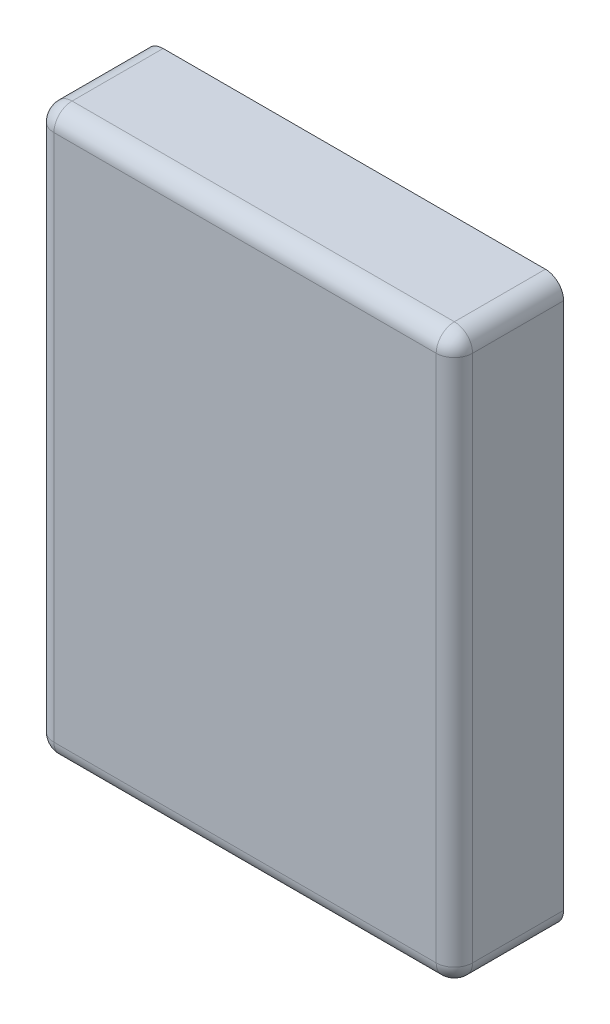
ISO-10303-21;
HEADER;
FILE_DESCRIPTION(('STEP AP214'),'2;1');
FILE_NAME('part.step','',(''),(''),'','','');
FILE_SCHEMA(('AUTOMOTIVE_DESIGN { 1 0 10303 214 1 1 1 1 }'));
ENDSEC;
DATA;
#1=APPLICATION_CONTEXT('core data for automotive mechanical design processes');
#2=APPLICATION_PROTOCOL_DEFINITION('international standard','automotive_design',2000,#1);
#3=PRODUCT_CONTEXT('',#1,'mechanical');
#4=PRODUCT('Part','Part','',(#3));
#5=PRODUCT_RELATED_PRODUCT_CATEGORY('part','',(#4));
#6=PRODUCT_DEFINITION_FORMATION('','',#4);
#7=PRODUCT_DEFINITION_CONTEXT('part definition',#1,'design');
#8=PRODUCT_DEFINITION('design','',#6,#7);
#9=PRODUCT_DEFINITION_SHAPE('','',#8);
#10=(LENGTH_UNIT() NAMED_UNIT(*) SI_UNIT(.MILLI.,.METRE.));
#11=(NAMED_UNIT(*) PLANE_ANGLE_UNIT() SI_UNIT($,.RADIAN.));
#12=(NAMED_UNIT(*) SI_UNIT($,.STERADIAN.) SOLID_ANGLE_UNIT());
#13=UNCERTAINTY_MEASURE_WITH_UNIT(LENGTH_MEASURE(1.E-05),#10,'distance_accuracy_value','');
#14=(GEOMETRIC_REPRESENTATION_CONTEXT(3) GLOBAL_UNCERTAINTY_ASSIGNED_CONTEXT((#13)) GLOBAL_UNIT_ASSIGNED_CONTEXT((#10,
#11,#12)) REPRESENTATION_CONTEXT('',''));
#15=CARTESIAN_POINT('',(0.,0.,0.));
#16=DIRECTION('',(0.,0.,1.));
#17=DIRECTION('',(1.,0.,0.));
#18=AXIS2_PLACEMENT_3D('',#15,#16,#17);
#19=CARTESIAN_POINT('',(8.817392921448,4.208681869507,1.13324762907E-08));
#20=DIRECTION('',(0.,1.,0.));
#21=DIRECTION('',(1.,0.,0.));
#22=AXIS2_PLACEMENT_3D('',#19,#20,#21);
#23=PLANE('',#22);
#24=DIRECTION('',(1.,0.,0.));
#25=VECTOR('',#24,1.);
#26=CARTESIAN_POINT('',(8.817392921448,4.208681869507,1.13324762907E-08));
#27=LINE('',#26,#25);
#28=CARTESIAN_POINT('',(8.917392921448,4.208681869507,1.13324762907E-08));
#29=VERTEX_POINT('',#28);
#30=CARTESIAN_POINT('',(11.017392921448,4.208681869507,1.13324762907E-08));
#31=VERTEX_POINT('',#30);
#32=EDGE_CURVE('E40',#29,#31,#27,.T.);
#33=ORIENTED_EDGE('',*,*,#32,.F.);
#34=DIRECTION('',(0.,0.,1.));
#35=VECTOR('',#34,1.);
#36=CARTESIAN_POINT('',(8.917392921448,4.208681869507,1.13324762907E-08));
#37=LINE('',#36,#35);
#38=CARTESIAN_POINT('',(8.917392921448,4.208681869507,0.500000011332));
#39=VERTEX_POINT('',#38);
#40=EDGE_CURVE('E11',#29,#39,#37,.T.);
#41=ORIENTED_EDGE('',*,*,#40,.T.);
#42=DIRECTION('',(1.,0.,0.));
#43=VECTOR('',#42,1.);
#44=CARTESIAN_POINT('',(8.817392921448,4.208681869507,0.500000011332));
#45=LINE('',#44,#43);
#46=CARTESIAN_POINT('',(11.017392921448,4.208681869507,0.500000011332));
#47=VERTEX_POINT('',#46);
#48=EDGE_CURVE('E27',#39,#47,#45,.T.);
#49=ORIENTED_EDGE('',*,*,#48,.T.);
#50=DIRECTION('',(0.,0.,1.));
#51=VECTOR('',#50,1.);
#52=CARTESIAN_POINT('',(11.017392921448,4.208681869507,1.13324762907E-08));
#53=LINE('',#52,#51);
#54=EDGE_CURVE('E208',#31,#47,#53,.T.);
#55=ORIENTED_EDGE('',*,*,#54,.F.);
#56=EDGE_LOOP('',(#33,#41,#49,#55));
#57=FACE_BOUND('',#56,.T.);
#58=ADVANCED_FACE('F16',(#57),#23,.T.);
#59=CARTESIAN_POINT('',(9.967392921448,2.658681869507,1.13324762907E-08));
#60=DIRECTION('',(0.,0.,1.));
#61=DIRECTION('',(1.,0.,0.));
#62=AXIS2_PLACEMENT_3D('',#59,#60,#61);
#63=PLANE('',#62);
#64=CARTESIAN_POINT('',(11.017392921448,4.108681869507,1.13324762907E-08));
#65=DIRECTION('',(0.,0.,-1.));
#66=DIRECTION('',(0.,-1.,0.));
#67=AXIS2_PLACEMENT_3D('',#64,#65,#66);
#68=CIRCLE('',#67,0.1);
#69=CARTESIAN_POINT('',(11.117392921448,4.108681869507,1.13324762907E-08));
#70=VERTEX_POINT('',#69);
#71=EDGE_CURVE('E212',#31,#70,#68,.T.);
#72=ORIENTED_EDGE('',*,*,#71,.T.);
#73=DIRECTION('',(0.,-1.,0.));
#74=VECTOR('',#73,1.);
#75=CARTESIAN_POINT('',(11.117392921448,4.208681869507,1.13324762907E-08));
#76=LINE('',#75,#74);
#77=CARTESIAN_POINT('',(11.117392921448,1.208681869507,1.13324762907E-08));
#78=VERTEX_POINT('',#77);
#79=EDGE_CURVE('E96',#70,#78,#76,.T.);
#80=ORIENTED_EDGE('',*,*,#79,.T.);
#81=CARTESIAN_POINT('',(11.017392921448,1.208681869507,1.13324762907E-08));
#82=DIRECTION('',(0.,0.,-1.));
#83=DIRECTION('',(0.,-1.,0.));
#84=AXIS2_PLACEMENT_3D('',#81,#82,#83);
#85=CIRCLE('',#84,0.1);
#86=CARTESIAN_POINT('',(11.017392921448,1.108681869507,1.13324762907E-08));
#87=VERTEX_POINT('',#86);
#88=EDGE_CURVE('E110',#78,#87,#85,.T.);
#89=ORIENTED_EDGE('',*,*,#88,.T.);
#90=DIRECTION('',(-1.,0.,0.));
#91=VECTOR('',#90,1.);
#92=CARTESIAN_POINT('',(11.117392921448,1.108681869507,1.13324762907E-08));
#93=LINE('',#92,#91);
#94=CARTESIAN_POINT('',(8.917392921448,1.108681869507,1.13324762907E-08));
#95=VERTEX_POINT('',#94);
#96=EDGE_CURVE('E178',#87,#95,#93,.T.);
#97=ORIENTED_EDGE('',*,*,#96,.T.);
#98=CARTESIAN_POINT('',(8.917392921448,1.208681869507,1.13324762907E-08));
#99=DIRECTION('',(0.,0.,-1.));
#100=DIRECTION('',(0.,-1.,0.));
#101=AXIS2_PLACEMENT_3D('',#98,#99,#100);
#102=CIRCLE('',#101,0.1);
#103=CARTESIAN_POINT('',(8.817392921448,1.208681869507,1.13324762907E-08));
#104=VERTEX_POINT('',#103);
#105=EDGE_CURVE('E200',#95,#104,#102,.T.);
#106=ORIENTED_EDGE('',*,*,#105,.T.);
#107=DIRECTION('',(0.,1.,0.));
#108=VECTOR('',#107,1.);
#109=CARTESIAN_POINT('',(8.817392921448,1.108681869507,1.13324762907E-08));
#110=LINE('',#109,#108);
#111=CARTESIAN_POINT('',(8.817392921448,4.108681869507,1.13324762907E-08));
#112=VERTEX_POINT('',#111);
#113=EDGE_CURVE('E65',#104,#112,#110,.T.);
#114=ORIENTED_EDGE('',*,*,#113,.T.);
#115=CARTESIAN_POINT('',(8.917392921448,4.108681869507,1.13324762907E-08));
#116=DIRECTION('',(0.,0.,1.));
#117=DIRECTION('',(0.,-1.,0.));
#118=AXIS2_PLACEMENT_3D('',#115,#116,#117);
#119=CIRCLE('',#118,0.1);
#120=EDGE_CURVE('E79',#29,#112,#119,.T.);
#121=ORIENTED_EDGE('',*,*,#120,.F.);
#122=ORIENTED_EDGE('',*,*,#32,.T.);
#123=EDGE_LOOP('',(#72,#80,#89,#97,#106,#114,#121,#122));
#124=FACE_BOUND('',#123,.T.);
#125=ADVANCED_FACE('F302',(#124),#63,.F.);
#126=CARTESIAN_POINT('',(8.917392921448,4.108681869507,1.13324762907E-08));
#127=DIRECTION('',(0.,0.,1.));
#128=DIRECTION('',(0.,1.,0.));
#129=AXIS2_PLACEMENT_3D('',#126,#127,#128);
#130=CYLINDRICAL_SURFACE('',#129,0.1);
#131=ORIENTED_EDGE('',*,*,#120,.T.);
#132=DIRECTION('',(0.,0.,1.));
#133=VECTOR('',#132,1.);
#134=CARTESIAN_POINT('',(8.817392921448,4.108681869507,1.13324762907E-08));
#135=LINE('',#134,#133);
#136=CARTESIAN_POINT('',(8.817392921448,4.108681869507,0.500000011332));
#137=VERTEX_POINT('',#136);
#138=EDGE_CURVE('E205',#112,#137,#135,.T.);
#139=ORIENTED_EDGE('',*,*,#138,.T.);
#140=CARTESIAN_POINT('',(8.917392921448,4.108681869507,0.500000011332));
#141=DIRECTION('',(0.,0.,1.));
#142=DIRECTION('',(0.,1.,0.));
#143=AXIS2_PLACEMENT_3D('',#140,#141,#142);
#144=CIRCLE('',#143,0.1);
#145=EDGE_CURVE('E174',#39,#137,#144,.T.);
#146=ORIENTED_EDGE('',*,*,#145,.F.);
#147=ORIENTED_EDGE('',*,*,#40,.F.);
#148=EDGE_LOOP('',(#131,#139,#146,#147));
#149=FACE_BOUND('',#148,.T.);
#150=ADVANCED_FACE('F301',(#149),#130,.T.);
#151=CARTESIAN_POINT('',(11.017392921448,4.108681869507,1.13324762907E-08));
#152=DIRECTION('',(0.,0.,1.));
#153=DIRECTION('',(0.,1.,0.));
#154=AXIS2_PLACEMENT_3D('',#151,#152,#153);
#155=CYLINDRICAL_SURFACE('',#154,0.1);
#156=ORIENTED_EDGE('',*,*,#54,.T.);
#157=CARTESIAN_POINT('',(11.017392921448,4.108681869507,0.500000011332));
#158=DIRECTION('',(0.,0.,1.));
#159=DIRECTION('',(0.,1.,0.));
#160=AXIS2_PLACEMENT_3D('',#157,#158,#159);
#161=CIRCLE('',#160,0.1);
#162=CARTESIAN_POINT('',(11.117392921448,4.108681869507,0.500000011332));
#163=VERTEX_POINT('',#162);
#164=EDGE_CURVE('E122',#163,#47,#161,.T.);
#165=ORIENTED_EDGE('',*,*,#164,.F.);
#166=DIRECTION('',(0.,0.,1.));
#167=VECTOR('',#166,1.);
#168=CARTESIAN_POINT('',(11.117392921448,4.108681869507,1.13324762907E-08));
#169=LINE('',#168,#167);
#170=EDGE_CURVE('E258',#70,#163,#169,.T.);
#171=ORIENTED_EDGE('',*,*,#170,.F.);
#172=ORIENTED_EDGE('',*,*,#71,.F.);
#173=EDGE_LOOP('',(#156,#165,#171,#172));
#174=FACE_BOUND('',#173,.T.);
#175=ADVANCED_FACE('F329',(#174),#155,.T.);
#176=CARTESIAN_POINT('',(8.817392921448,4.108681869507,0.500000011332));
#177=DIRECTION('',(1.,0.,0.));
#178=DIRECTION('',(0.,1.,0.));
#179=AXIS2_PLACEMENT_3D('',#176,#177,#178);
#180=CYLINDRICAL_SURFACE('',#179,0.1);
#181=CARTESIAN_POINT('',(8.917392921448,4.108681869507,0.500000011332));
#182=DIRECTION('',(-1.,0.,0.));
#183=DIRECTION('',(0.,1.,0.));
#184=AXIS2_PLACEMENT_3D('',#181,#182,#183);
#185=CIRCLE('',#184,0.1);
#186=CARTESIAN_POINT('',(8.917392921448,4.108681869507,0.600000011332));
#187=VERTEX_POINT('',#186);
#188=EDGE_CURVE('E222',#187,#39,#185,.T.);
#189=ORIENTED_EDGE('',*,*,#188,.F.);
#190=DIRECTION('',(1.,0.,0.));
#191=VECTOR('',#190,1.);
#192=CARTESIAN_POINT('',(8.817392921448,4.108681869507,0.600000011332));
#193=LINE('',#192,#191);
#194=CARTESIAN_POINT('',(11.017392921448,4.108681869507,0.600000011332));
#195=VERTEX_POINT('',#194);
#196=EDGE_CURVE('E268',#187,#195,#193,.T.);
#197=ORIENTED_EDGE('',*,*,#196,.T.);
#198=CARTESIAN_POINT('',(11.017392921448,4.108681869507,0.500000011332));
#199=DIRECTION('',(1.,0.,0.));
#200=DIRECTION('',(0.,1.,0.));
#201=AXIS2_PLACEMENT_3D('',#198,#199,#200);
#202=CIRCLE('',#201,0.1);
#203=EDGE_CURVE('E221',#47,#195,#202,.T.);
#204=ORIENTED_EDGE('',*,*,#203,.F.);
#205=ORIENTED_EDGE('',*,*,#48,.F.);
#206=EDGE_LOOP('',(#189,#197,#204,#205));
#207=FACE_BOUND('',#206,.T.);
#208=ADVANCED_FACE('F298',(#207),#180,.T.);
#209=CARTESIAN_POINT('',(8.817392921448,1.108681869507,1.13324762907E-08));
#210=DIRECTION('',(-1.,0.,0.));
#211=DIRECTION('',(0.,0.,1.));
#212=AXIS2_PLACEMENT_3D('',#209,#210,#211);
#213=PLANE('',#212);
#214=ORIENTED_EDGE('',*,*,#113,.F.);
#215=DIRECTION('',(0.,0.,1.));
#216=VECTOR('',#215,1.);
#217=CARTESIAN_POINT('',(8.817392921448,1.208681869507,1.13324762907E-08));
#218=LINE('',#217,#216);
#219=CARTESIAN_POINT('',(8.817392921448,1.208681869507,0.500000011332));
#220=VERTEX_POINT('',#219);
#221=EDGE_CURVE('E193',#104,#220,#218,.T.);
#222=ORIENTED_EDGE('',*,*,#221,.T.);
#223=DIRECTION('',(0.,1.,0.));
#224=VECTOR('',#223,1.);
#225=CARTESIAN_POINT('',(8.817392921448,1.108681869507,0.500000011332));
#226=LINE('',#225,#224);
#227=EDGE_CURVE('E267',#220,#137,#226,.T.);
#228=ORIENTED_EDGE('',*,*,#227,.T.);
#229=ORIENTED_EDGE('',*,*,#138,.F.);
#230=EDGE_LOOP('',(#214,#222,#228,#229));
#231=FACE_BOUND('',#230,.T.);
#232=ADVANCED_FACE('F284',(#231),#213,.T.);
#233=CARTESIAN_POINT('',(11.117392921448,4.208681869507,1.13324762907E-08));
#234=DIRECTION('',(1.,0.,0.));
#235=DIRECTION('',(0.,1.,0.));
#236=AXIS2_PLACEMENT_3D('',#233,#234,#235);
#237=PLANE('',#236);
#238=ORIENTED_EDGE('',*,*,#79,.F.);
#239=ORIENTED_EDGE('',*,*,#170,.T.);
#240=DIRECTION('',(0.,-1.,0.));
#241=VECTOR('',#240,1.);
#242=CARTESIAN_POINT('',(11.117392921448,4.208681869507,0.500000011332));
#243=LINE('',#242,#241);
#244=CARTESIAN_POINT('',(11.117392921448,1.208681869507,0.500000011332));
#245=VERTEX_POINT('',#244);
#246=EDGE_CURVE('E217',#163,#245,#243,.T.);
#247=ORIENTED_EDGE('',*,*,#246,.T.);
#248=DIRECTION('',(0.,0.,1.));
#249=VECTOR('',#248,1.);
#250=CARTESIAN_POINT('',(11.117392921448,1.208681869507,1.13324762907E-08));
#251=LINE('',#250,#249);
#252=EDGE_CURVE('E159',#78,#245,#251,.T.);
#253=ORIENTED_EDGE('',*,*,#252,.F.);
#254=EDGE_LOOP('',(#238,#239,#247,#253));
#255=FACE_BOUND('',#254,.T.);
#256=ADVANCED_FACE('F309',(#255),#237,.T.);
#257=CARTESIAN_POINT('',(8.917392921448,1.208681869507,1.13324762907E-08));
#258=DIRECTION('',(0.,0.,1.));
#259=DIRECTION('',(0.,-1.,0.));
#260=AXIS2_PLACEMENT_3D('',#257,#258,#259);
#261=CYLINDRICAL_SURFACE('',#260,0.1);
#262=DIRECTION('',(0.,0.,1.));
#263=VECTOR('',#262,1.);
#264=CARTESIAN_POINT('',(8.917392921448,1.108681869507,1.13324762907E-08));
#265=LINE('',#264,#263);
#266=CARTESIAN_POINT('',(8.917392921448,1.108681869507,0.500000011332));
#267=VERTEX_POINT('',#266);
#268=EDGE_CURVE('E213',#95,#267,#265,.T.);
#269=ORIENTED_EDGE('',*,*,#268,.T.);
#270=CARTESIAN_POINT('',(8.917392921448,1.208681869507,0.500000011332));
#271=DIRECTION('',(0.,0.,-1.));
#272=DIRECTION('',(-1.,0.,0.));
#273=AXIS2_PLACEMENT_3D('',#270,#271,#272);
#274=CIRCLE('',#273,0.1);
#275=EDGE_CURVE('E218',#267,#220,#274,.T.);
#276=ORIENTED_EDGE('',*,*,#275,.T.);
#277=ORIENTED_EDGE('',*,*,#221,.F.);
#278=ORIENTED_EDGE('',*,*,#105,.F.);
#279=EDGE_LOOP('',(#269,#276,#277,#278));
#280=FACE_BOUND('',#279,.T.);
#281=ADVANCED_FACE('F304',(#280),#261,.T.);
#282=CARTESIAN_POINT('',(11.017392921448,1.208681869507,1.13324762907E-08));
#283=DIRECTION('',(0.,0.,1.));
#284=DIRECTION('',(1.,0.,0.));
#285=AXIS2_PLACEMENT_3D('',#282,#283,#284);
#286=CYLINDRICAL_SURFACE('',#285,0.1);
#287=ORIENTED_EDGE('',*,*,#252,.T.);
#288=CARTESIAN_POINT('',(11.017392921448,1.208681869507,0.500000011332));
#289=DIRECTION('',(0.,0.,1.));
#290=DIRECTION('',(1.,0.,0.));
#291=AXIS2_PLACEMENT_3D('',#288,#289,#290);
#292=CIRCLE('',#291,0.1);
#293=CARTESIAN_POINT('',(11.017392921448,1.108681869507,0.500000011332));
#294=VERTEX_POINT('',#293);
#295=EDGE_CURVE('E156',#294,#245,#292,.T.);
#296=ORIENTED_EDGE('',*,*,#295,.F.);
#297=DIRECTION('',(0.,0.,1.));
#298=VECTOR('',#297,1.);
#299=CARTESIAN_POINT('',(11.017392921448,1.108681869507,1.13324762907E-08));
#300=LINE('',#299,#298);
#301=EDGE_CURVE('E158',#87,#294,#300,.T.);
#302=ORIENTED_EDGE('',*,*,#301,.F.);
#303=ORIENTED_EDGE('',*,*,#88,.F.);
#304=EDGE_LOOP('',(#287,#296,#302,#303));
#305=FACE_BOUND('',#304,.T.);
#306=ADVANCED_FACE('F157',(#305),#286,.T.);
#307=CARTESIAN_POINT('',(11.117392921448,1.108681869507,1.13324762907E-08));
#308=DIRECTION('',(0.,-1.,0.));
#309=DIRECTION('',(0.,0.,-1.));
#310=AXIS2_PLACEMENT_3D('',#307,#308,#309);
#311=PLANE('',#310);
#312=ORIENTED_EDGE('',*,*,#96,.F.);
#313=ORIENTED_EDGE('',*,*,#301,.T.);
#314=DIRECTION('',(-1.,0.,0.));
#315=VECTOR('',#314,1.);
#316=CARTESIAN_POINT('',(11.117392921448,1.108681869507,0.500000011332));
#317=LINE('',#316,#315);
#318=EDGE_CURVE('E152',#294,#267,#317,.T.);
#319=ORIENTED_EDGE('',*,*,#318,.T.);
#320=ORIENTED_EDGE('',*,*,#268,.F.);
#321=EDGE_LOOP('',(#312,#313,#319,#320));
#322=FACE_BOUND('',#321,.T.);
#323=ADVANCED_FACE('F176',(#322),#311,.T.);
#324=CARTESIAN_POINT('',(8.917392921448,4.108681869507,0.500000011332));
#325=DIRECTION('',(0.,0.,-1.));
#326=DIRECTION('',(0.,1.,0.));
#327=AXIS2_PLACEMENT_3D('',#324,#325,#326);
#328=SPHERICAL_SURFACE('',#327,0.1);
#329=ORIENTED_EDGE('',*,*,#145,.T.);
#330=CARTESIAN_POINT('',(8.917392921448,4.108681869507,0.500000011332));
#331=DIRECTION('',(0.,-1.,0.));
#332=DIRECTION('',(-1.,0.,0.));
#333=AXIS2_PLACEMENT_3D('',#330,#331,#332);
#334=CIRCLE('',#333,0.1);
#335=EDGE_CURVE('E134',#187,#137,#334,.T.);
#336=ORIENTED_EDGE('',*,*,#335,.F.);
#337=ORIENTED_EDGE('',*,*,#188,.T.);
#338=EDGE_LOOP('',(#329,#336,#337));
#339=FACE_BOUND('',#338,.T.);
#340=ADVANCED_FACE('F300',(#339),#328,.T.);
#341=CARTESIAN_POINT('',(11.017392921448,4.108681869507,0.500000011332));
#342=DIRECTION('',(-1.,0.,0.));
#343=DIRECTION('',(0.,1.,0.));
#344=AXIS2_PLACEMENT_3D('',#341,#342,#343);
#345=SPHERICAL_SURFACE('',#344,0.1);
#346=ORIENTED_EDGE('',*,*,#203,.T.);
#347=CARTESIAN_POINT('',(11.017392921448,4.108681869507,0.500000011332));
#348=DIRECTION('',(0.,-1.,0.));
#349=DIRECTION('',(0.,0.,1.));
#350=AXIS2_PLACEMENT_3D('',#347,#348,#349);
#351=CIRCLE('',#350,0.1);
#352=EDGE_CURVE('E196',#163,#195,#351,.T.);
#353=ORIENTED_EDGE('',*,*,#352,.F.);
#354=ORIENTED_EDGE('',*,*,#164,.T.);
#355=EDGE_LOOP('',(#346,#353,#354));
#356=FACE_BOUND('',#355,.T.);
#357=ADVANCED_FACE('F366',(#356),#345,.T.);
#358=CARTESIAN_POINT('',(9.967392921448,2.658681869507,0.600000011332));
#359=DIRECTION('',(0.,0.,1.));
#360=DIRECTION('',(1.,0.,0.));
#361=AXIS2_PLACEMENT_3D('',#358,#359,#360);
#362=PLANE('',#361);
#363=ORIENTED_EDGE('',*,*,#196,.F.);
#364=DIRECTION('',(0.,1.,0.));
#365=VECTOR('',#364,1.);
#366=CARTESIAN_POINT('',(8.917392921448,1.108681869507,0.600000011332));
#367=LINE('',#366,#365);
#368=CARTESIAN_POINT('',(8.917392921448,1.208681869507,0.600000011332));
#369=VERTEX_POINT('',#368);
#370=EDGE_CURVE('E201',#369,#187,#367,.T.);
#371=ORIENTED_EDGE('',*,*,#370,.F.);
#372=DIRECTION('',(-1.,0.,0.));
#373=VECTOR('',#372,1.);
#374=CARTESIAN_POINT('',(11.117392921448,1.208681869507,0.600000011332));
#375=LINE('',#374,#373);
#376=CARTESIAN_POINT('',(11.017392921448,1.208681869507,0.600000011332));
#377=VERTEX_POINT('',#376);
#378=EDGE_CURVE('E20',#377,#369,#375,.T.);
#379=ORIENTED_EDGE('',*,*,#378,.F.);
#380=DIRECTION('',(0.,-1.,0.));
#381=VECTOR('',#380,1.);
#382=CARTESIAN_POINT('',(11.017392921448,4.208681869507,0.600000011332));
#383=LINE('',#382,#381);
#384=EDGE_CURVE('E195',#195,#377,#383,.T.);
#385=ORIENTED_EDGE('',*,*,#384,.F.);
#386=EDGE_LOOP('',(#363,#371,#379,#385));
#387=FACE_BOUND('',#386,.T.);
#388=ADVANCED_FACE('F294',(#387),#362,.T.);
#389=CARTESIAN_POINT('',(8.917392921448,1.108681869507,0.500000011332));
#390=DIRECTION('',(0.,1.,0.));
#391=DIRECTION('',(-1.,0.,0.));
#392=AXIS2_PLACEMENT_3D('',#389,#390,#391);
#393=CYLINDRICAL_SURFACE('',#392,0.1);
#394=ORIENTED_EDGE('',*,*,#227,.F.);
#395=CARTESIAN_POINT('',(8.917392921448,1.208681869507,0.500000011332));
#396=DIRECTION('',(0.,-1.,0.));
#397=DIRECTION('',(0.,0.,1.));
#398=AXIS2_PLACEMENT_3D('',#395,#396,#397);
#399=CIRCLE('',#398,0.1);
#400=EDGE_CURVE('E248',#369,#220,#399,.T.);
#401=ORIENTED_EDGE('',*,*,#400,.F.);
#402=ORIENTED_EDGE('',*,*,#370,.T.);
#403=ORIENTED_EDGE('',*,*,#335,.T.);
#404=EDGE_LOOP('',(#394,#401,#402,#403));
#405=FACE_BOUND('',#404,.T.);
#406=ADVANCED_FACE('F290',(#405),#393,.T.);
#407=CARTESIAN_POINT('',(11.017392921448,4.208681869507,0.500000011332));
#408=DIRECTION('',(0.,-1.,0.));
#409=DIRECTION('',(1.,0.,0.));
#410=AXIS2_PLACEMENT_3D('',#407,#408,#409);
#411=CYLINDRICAL_SURFACE('',#410,0.1);
#412=ORIENTED_EDGE('',*,*,#352,.T.);
#413=ORIENTED_EDGE('',*,*,#384,.T.);
#414=CARTESIAN_POINT('',(11.017392921448,1.208681869507,0.500000011332));
#415=DIRECTION('',(0.,1.,0.));
#416=DIRECTION('',(0.,0.,1.));
#417=AXIS2_PLACEMENT_3D('',#414,#415,#416);
#418=CIRCLE('',#417,0.1);
#419=EDGE_CURVE('E183',#377,#245,#418,.T.);
#420=ORIENTED_EDGE('',*,*,#419,.T.);
#421=ORIENTED_EDGE('',*,*,#246,.F.);
#422=EDGE_LOOP('',(#412,#413,#420,#421));
#423=FACE_BOUND('',#422,.T.);
#424=ADVANCED_FACE('F18',(#423),#411,.T.);
#425=CARTESIAN_POINT('',(8.917392921448,1.208681869507,0.500000011332));
#426=DIRECTION('',(0.,1.,0.));
#427=DIRECTION('',(0.,0.,1.));
#428=AXIS2_PLACEMENT_3D('',#425,#426,#427);
#429=SPHERICAL_SURFACE('',#428,0.1);
#430=ORIENTED_EDGE('',*,*,#400,.T.);
#431=ORIENTED_EDGE('',*,*,#275,.F.);
#432=CARTESIAN_POINT('',(8.917392921448,1.208681869507,0.500000011332));
#433=DIRECTION('',(-1.,0.,0.));
#434=DIRECTION('',(0.,0.,1.));
#435=AXIS2_PLACEMENT_3D('',#432,#433,#434);
#436=CIRCLE('',#435,0.1);
#437=EDGE_CURVE('E165',#267,#369,#436,.T.);
#438=ORIENTED_EDGE('',*,*,#437,.T.);
#439=EDGE_LOOP('',(#430,#431,#438));
#440=FACE_BOUND('',#439,.T.);
#441=ADVANCED_FACE('F288',(#440),#429,.T.);
#442=CARTESIAN_POINT('',(11.017392921448,1.208681869507,0.500000011332));
#443=DIRECTION('',(0.,1.,0.));
#444=DIRECTION('',(0.,0.,1.));
#445=AXIS2_PLACEMENT_3D('',#442,#443,#444);
#446=SPHERICAL_SURFACE('',#445,0.1);
#447=CARTESIAN_POINT('',(11.017392921448,1.208681869507,0.500000011332));
#448=DIRECTION('',(-1.,0.,0.));
#449=DIRECTION('',(0.,0.,1.));
#450=AXIS2_PLACEMENT_3D('',#447,#448,#449);
#451=CIRCLE('',#450,0.1);
#452=EDGE_CURVE('E166',#294,#377,#451,.T.);
#453=ORIENTED_EDGE('',*,*,#452,.F.);
#454=ORIENTED_EDGE('',*,*,#295,.T.);
#455=ORIENTED_EDGE('',*,*,#419,.F.);
#456=EDGE_LOOP('',(#453,#454,#455));
#457=FACE_BOUND('',#456,.T.);
#458=ADVANCED_FACE('F181',(#457),#446,.T.);
#459=CARTESIAN_POINT('',(11.117392921448,1.208681869507,0.500000011332));
#460=DIRECTION('',(-1.,0.,0.));
#461=DIRECTION('',(0.,-1.,0.));
#462=AXIS2_PLACEMENT_3D('',#459,#460,#461);
#463=CYLINDRICAL_SURFACE('',#462,0.1);
#464=ORIENTED_EDGE('',*,*,#452,.T.);
#465=ORIENTED_EDGE('',*,*,#378,.T.);
#466=ORIENTED_EDGE('',*,*,#437,.F.);
#467=ORIENTED_EDGE('',*,*,#318,.F.);
#468=EDGE_LOOP('',(#464,#465,#466,#467));
#469=FACE_BOUND('',#468,.T.);
#470=ADVANCED_FACE('F171',(#469),#463,.T.);
#471=CLOSED_SHELL('',(#58,#125,#150,#175,#208,#232,#256,#281,#306,#323,#340,#357,#388,#406,#424,
#441,#458,#470));
#472=MANIFOLD_SOLID_BREP('B1',#471);
#473=ADVANCED_BREP_SHAPE_REPRESENTATION('',(#18,#472),#14);
#474=SHAPE_DEFINITION_REPRESENTATION(#9,#473);
ENDSEC;
END-ISO-10303-21;
